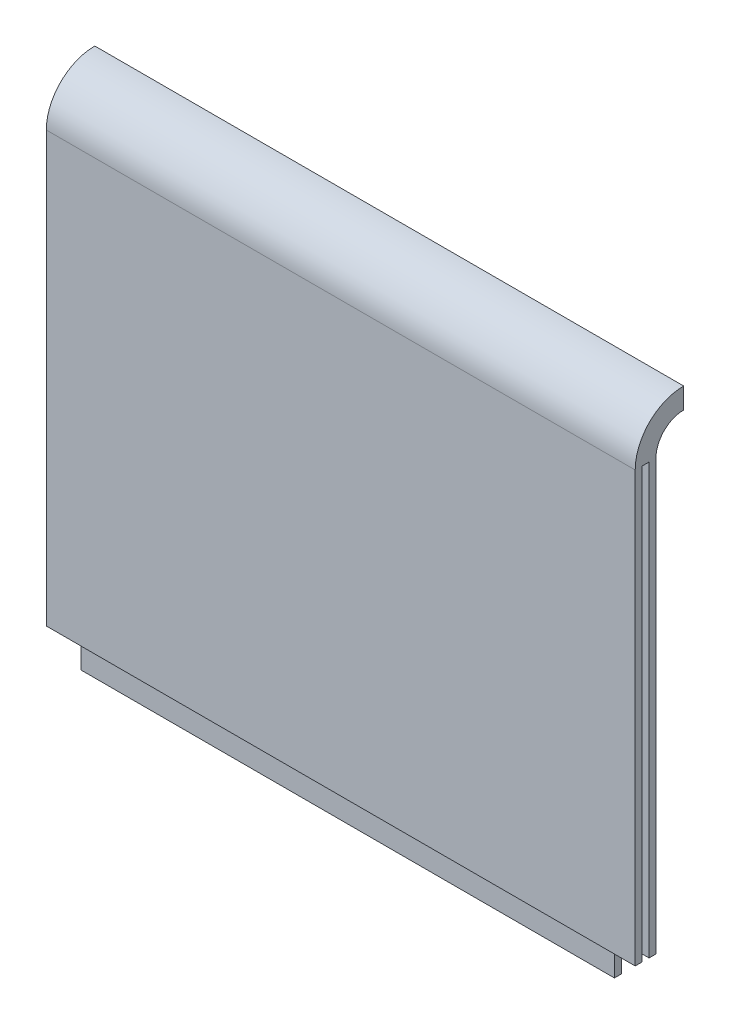
ISO-10303-21;
HEADER;
FILE_DESCRIPTION(('STEP AP214'),'2;1');
FILE_NAME('part.step','',(''),(''),'','','');
FILE_SCHEMA(('AUTOMOTIVE_DESIGN { 1 0 10303 214 1 1 1 1 }'));
ENDSEC;
DATA;
#1=APPLICATION_CONTEXT('core data for automotive mechanical design processes');
#2=APPLICATION_PROTOCOL_DEFINITION('international standard','automotive_design',2000,#1);
#3=PRODUCT_CONTEXT('',#1,'mechanical');
#4=PRODUCT('Part','Part','',(#3));
#5=PRODUCT_RELATED_PRODUCT_CATEGORY('part','',(#4));
#6=PRODUCT_DEFINITION_FORMATION('','',#4);
#7=PRODUCT_DEFINITION_CONTEXT('part definition',#1,'design');
#8=PRODUCT_DEFINITION('design','',#6,#7);
#9=PRODUCT_DEFINITION_SHAPE('','',#8);
#10=(LENGTH_UNIT() NAMED_UNIT(*) SI_UNIT(.MILLI.,.METRE.));
#11=(NAMED_UNIT(*) PLANE_ANGLE_UNIT() SI_UNIT($,.RADIAN.));
#12=(NAMED_UNIT(*) SI_UNIT($,.STERADIAN.) SOLID_ANGLE_UNIT());
#13=UNCERTAINTY_MEASURE_WITH_UNIT(LENGTH_MEASURE(1.E-05),#10,'distance_accuracy_value','');
#14=(GEOMETRIC_REPRESENTATION_CONTEXT(3) GLOBAL_UNCERTAINTY_ASSIGNED_CONTEXT((#13)) GLOBAL_UNIT_ASSIGNED_CONTEXT((#10,
#11,#12)) REPRESENTATION_CONTEXT('',''));
#15=CARTESIAN_POINT('',(0.,0.,0.));
#16=DIRECTION('',(0.,0.,1.));
#17=DIRECTION('',(1.,0.,0.));
#18=AXIS2_PLACEMENT_3D('',#15,#16,#17);
#19=CARTESIAN_POINT('',(-42.5,-8.50000000000001,15.75));
#20=DIRECTION('',(0.,1.,0.));
#21=DIRECTION('',(-1.,0.,0.));
#22=AXIS2_PLACEMENT_3D('',#19,#20,#21);
#23=PLANE('',#22);
#24=DIRECTION('',(-1.,0.,0.));
#25=VECTOR('',#24,1.);
#26=CARTESIAN_POINT('',(-38.5,-8.50000000000001,11.75));
#27=LINE('',#26,#25);
#28=CARTESIAN_POINT('',(38.5,-8.5,11.75));
#29=VERTEX_POINT('',#28);
#30=CARTESIAN_POINT('',(-38.5,-8.50000000000001,11.75));
#31=VERTEX_POINT('',#30);
#32=EDGE_CURVE('E64',#29,#31,#27,.T.);
#33=ORIENTED_EDGE('',*,*,#32,.F.);
#34=DIRECTION('',(1.,0.,0.));
#35=VECTOR('',#34,1.);
#36=CARTESIAN_POINT('',(38.5,-8.5,11.75));
#37=LINE('',#36,#35);
#38=CARTESIAN_POINT('',(42.5,-8.5,11.75));
#39=VERTEX_POINT('',#38);
#40=EDGE_CURVE('E235',#29,#39,#37,.T.);
#41=ORIENTED_EDGE('',*,*,#40,.T.);
#42=DIRECTION('',(0.,0.,-1.));
#43=VECTOR('',#42,1.);
#44=CARTESIAN_POINT('',(42.5,-8.5,15.75));
#45=LINE('',#44,#43);
#46=CARTESIAN_POINT('',(42.5,-8.5,12.75));
#47=VERTEX_POINT('',#46);
#48=EDGE_CURVE('E11',#47,#39,#45,.T.);
#49=ORIENTED_EDGE('',*,*,#48,.F.);
#50=DIRECTION('',(-1.,0.,0.));
#51=VECTOR('',#50,1.);
#52=CARTESIAN_POINT('',(0.,-8.50000000000001,12.75));
#53=LINE('',#52,#51);
#54=CARTESIAN_POINT('',(-42.5,-8.50000000000001,12.75));
#55=VERTEX_POINT('',#54);
#56=EDGE_CURVE('E292',#47,#55,#53,.T.);
#57=ORIENTED_EDGE('',*,*,#56,.T.);
#58=DIRECTION('',(0.,0.,-1.));
#59=VECTOR('',#58,1.);
#60=CARTESIAN_POINT('',(-42.5,-8.50000000000001,15.75));
#61=LINE('',#60,#59);
#62=CARTESIAN_POINT('',(-42.5,-8.50000000000001,11.75));
#63=VERTEX_POINT('',#62);
#64=EDGE_CURVE('E255',#55,#63,#61,.T.);
#65=ORIENTED_EDGE('',*,*,#64,.T.);
#66=DIRECTION('',(-1.,0.,0.));
#67=VECTOR('',#66,1.);
#68=CARTESIAN_POINT('',(-38.5,-8.50000000000001,11.75));
#69=LINE('',#68,#67);
#70=EDGE_CURVE('E218',#31,#63,#69,.T.);
#71=ORIENTED_EDGE('',*,*,#70,.F.);
#72=EDGE_LOOP('',(#33,#41,#49,#57,#65,#71));
#73=FACE_BOUND('',#72,.T.);
#74=ADVANCED_FACE('F38',(#73),#23,.F.);
#75=DIRECTION('',(1.,0.,0.));
#76=VECTOR('',#75,1.);
#77=CARTESIAN_POINT('',(-38.5,-8.50000000000001,10.75));
#78=LINE('',#77,#76);
#79=CARTESIAN_POINT('',(-38.5,-8.50000000000001,10.75));
#80=VERTEX_POINT('',#79);
#81=CARTESIAN_POINT('',(38.5,-8.5,10.75));
#82=VERTEX_POINT('',#81);
#83=EDGE_CURVE('E56',#80,#82,#78,.T.);
#84=ORIENTED_EDGE('',*,*,#83,.F.);
#85=DIRECTION('',(-1.,0.,0.));
#86=VECTOR('',#85,1.);
#87=CARTESIAN_POINT('',(-38.5,-8.50000000000001,10.75));
#88=LINE('',#87,#86);
#89=CARTESIAN_POINT('',(-42.5,-8.50000000000001,10.75));
#90=VERTEX_POINT('',#89);
#91=EDGE_CURVE('E203',#80,#90,#88,.T.);
#92=ORIENTED_EDGE('',*,*,#91,.T.);
#93=CARTESIAN_POINT('',(-42.5,-8.50000000000001,9.75));
#94=VERTEX_POINT('',#93);
#95=EDGE_CURVE('E259',#90,#94,#61,.T.);
#96=ORIENTED_EDGE('',*,*,#95,.T.);
#97=DIRECTION('',(-1.,0.,0.));
#98=VECTOR('',#97,1.);
#99=CARTESIAN_POINT('',(0.,-8.50000000000001,9.75));
#100=LINE('',#99,#98);
#101=CARTESIAN_POINT('',(42.5,-8.5,9.75));
#102=VERTEX_POINT('',#101);
#103=EDGE_CURVE('E272',#102,#94,#100,.T.);
#104=ORIENTED_EDGE('',*,*,#103,.F.);
#105=CARTESIAN_POINT('',(42.5,-8.5,10.75));
#106=VERTEX_POINT('',#105);
#107=EDGE_CURVE('E48',#106,#102,#45,.T.);
#108=ORIENTED_EDGE('',*,*,#107,.F.);
#109=DIRECTION('',(1.,0.,0.));
#110=VECTOR('',#109,1.);
#111=CARTESIAN_POINT('',(38.5,-8.5,10.75));
#112=LINE('',#111,#110);
#113=EDGE_CURVE('E250',#82,#106,#112,.T.);
#114=ORIENTED_EDGE('',*,*,#113,.F.);
#115=EDGE_LOOP('',(#84,#92,#96,#104,#108,#114));
#116=FACE_BOUND('',#115,.T.);
#117=ADVANCED_FACE('F375',(#116),#23,.F.);
#118=CARTESIAN_POINT('',(0.,0.,5.75));
#119=DIRECTION('',(0.,0.,1.));
#120=DIRECTION('',(1.,0.,0.));
#121=AXIS2_PLACEMENT_3D('',#118,#119,#120);
#122=PLANE('',#121);
#123=DIRECTION('',(0.,-1.,0.));
#124=VECTOR('',#123,1.);
#125=CARTESIAN_POINT('',(-42.5,60.5,5.75));
#126=LINE('',#125,#124);
#127=CARTESIAN_POINT('',(-42.5,60.5,5.75));
#128=VERTEX_POINT('',#127);
#129=CARTESIAN_POINT('',(-42.5,57.5,5.75));
#130=VERTEX_POINT('',#129);
#131=EDGE_CURVE('E310',#128,#130,#126,.T.);
#132=ORIENTED_EDGE('',*,*,#131,.F.);
#133=DIRECTION('',(1.,0.,0.));
#134=VECTOR('',#133,1.);
#135=CARTESIAN_POINT('',(-105.,60.5,5.75));
#136=LINE('',#135,#134);
#137=CARTESIAN_POINT('',(42.5,60.5,5.75));
#138=VERTEX_POINT('',#137);
#139=EDGE_CURVE('E304',#128,#138,#136,.T.);
#140=ORIENTED_EDGE('',*,*,#139,.T.);
#141=DIRECTION('',(0.,1.,0.));
#142=VECTOR('',#141,1.);
#143=CARTESIAN_POINT('',(42.5,60.5,5.75));
#144=LINE('',#143,#142);
#145=CARTESIAN_POINT('',(42.5,57.5,5.75));
#146=VERTEX_POINT('',#145);
#147=EDGE_CURVE('E42',#146,#138,#144,.T.);
#148=ORIENTED_EDGE('',*,*,#147,.F.);
#149=DIRECTION('',(-1.,0.,0.));
#150=VECTOR('',#149,1.);
#151=CARTESIAN_POINT('',(98.,57.5,5.75));
#152=LINE('',#151,#150);
#153=EDGE_CURVE('E260',#130,#146,#152,.F.);
#154=ORIENTED_EDGE('',*,*,#153,.F.);
#155=EDGE_LOOP('',(#132,#140,#148,#154));
#156=FACE_BOUND('',#155,.T.);
#157=ADVANCED_FACE('F329',(#156),#122,.F.);
#158=CARTESIAN_POINT('',(-42.5,60.5,15.75));
#159=DIRECTION('',(1.,0.,0.));
#160=DIRECTION('',(0.,1.,0.));
#161=AXIS2_PLACEMENT_3D('',#158,#159,#160);
#162=PLANE('',#161);
#163=ORIENTED_EDGE('',*,*,#95,.F.);
#164=DIRECTION('',(0.,-1.,0.));
#165=VECTOR('',#164,1.);
#166=CARTESIAN_POINT('',(-42.5,-8.50000000000001,10.75));
#167=LINE('',#166,#165);
#168=CARTESIAN_POINT('',(-42.5,53.5,10.75));
#169=VERTEX_POINT('',#168);
#170=EDGE_CURVE('E182',#169,#90,#167,.T.);
#171=ORIENTED_EDGE('',*,*,#170,.F.);
#172=DIRECTION('',(0.,0.,-1.));
#173=VECTOR('',#172,1.);
#174=CARTESIAN_POINT('',(-42.5,53.5,11.75));
#175=LINE('',#174,#173);
#176=CARTESIAN_POINT('',(-42.5,53.5,11.75));
#177=VERTEX_POINT('',#176);
#178=EDGE_CURVE('E197',#177,#169,#175,.T.);
#179=ORIENTED_EDGE('',*,*,#178,.F.);
#180=DIRECTION('',(0.,1.,0.));
#181=VECTOR('',#180,1.);
#182=CARTESIAN_POINT('',(-42.5,-8.50000000000001,11.75));
#183=LINE('',#182,#181);
#184=EDGE_CURVE('E186',#63,#177,#183,.T.);
#185=ORIENTED_EDGE('',*,*,#184,.F.);
#186=ORIENTED_EDGE('',*,*,#64,.F.);
#187=DIRECTION('',(0.,1.,0.));
#188=VECTOR('',#187,1.);
#189=CARTESIAN_POINT('',(-42.5,0.,12.75));
#190=LINE('',#189,#188);
#191=CARTESIAN_POINT('',(-42.5,53.5,12.75));
#192=VERTEX_POINT('',#191);
#193=EDGE_CURVE('E284',#55,#192,#190,.T.);
#194=ORIENTED_EDGE('',*,*,#193,.T.);
#195=CARTESIAN_POINT('',(-42.5,53.5,5.75));
#196=DIRECTION('',(1.,0.,0.));
#197=DIRECTION('',(0.,1.,0.));
#198=AXIS2_PLACEMENT_3D('',#195,#196,#197);
#199=CIRCLE('',#198,7.);
#200=EDGE_CURVE('E296',#192,#128,#199,.F.);
#201=ORIENTED_EDGE('',*,*,#200,.T.);
#202=ORIENTED_EDGE('',*,*,#131,.T.);
#203=CARTESIAN_POINT('',(-42.5,53.5,5.75));
#204=DIRECTION('',(1.,0.,0.));
#205=DIRECTION('',(0.,1.,0.));
#206=AXIS2_PLACEMENT_3D('',#203,#204,#205);
#207=CIRCLE('',#206,4.);
#208=CARTESIAN_POINT('',(-42.5,53.5,9.75));
#209=VERTEX_POINT('',#208);
#210=EDGE_CURVE('E268',#209,#130,#207,.F.);
#211=ORIENTED_EDGE('',*,*,#210,.F.);
#212=DIRECTION('',(0.,1.,0.));
#213=VECTOR('',#212,1.);
#214=CARTESIAN_POINT('',(-42.5,0.,9.75));
#215=LINE('',#214,#213);
#216=EDGE_CURVE('E280',#94,#209,#215,.T.);
#217=ORIENTED_EDGE('',*,*,#216,.F.);
#218=EDGE_LOOP('',(#163,#171,#179,#185,#186,#194,#201,#202,#211,#217));
#219=FACE_BOUND('',#218,.T.);
#220=ADVANCED_FACE('F385',(#219),#162,.F.);
#221=CARTESIAN_POINT('',(42.5,60.5,15.75));
#222=DIRECTION('',(-1.,0.,0.));
#223=DIRECTION('',(0.,-1.,0.));
#224=AXIS2_PLACEMENT_3D('',#221,#222,#223);
#225=PLANE('',#224);
#226=ORIENTED_EDGE('',*,*,#48,.T.);
#227=DIRECTION('',(0.,-1.,0.));
#228=VECTOR('',#227,1.);
#229=CARTESIAN_POINT('',(42.5,-8.5,11.75));
#230=LINE('',#229,#228);
#231=CARTESIAN_POINT('',(42.5,53.5,11.75));
#232=VERTEX_POINT('',#231);
#233=EDGE_CURVE('E214',#232,#39,#230,.T.);
#234=ORIENTED_EDGE('',*,*,#233,.F.);
#235=DIRECTION('',(0.,0.,1.));
#236=VECTOR('',#235,1.);
#237=CARTESIAN_POINT('',(42.5,53.5,10.75));
#238=LINE('',#237,#236);
#239=CARTESIAN_POINT('',(42.5,53.5,10.75));
#240=VERTEX_POINT('',#239);
#241=EDGE_CURVE('E227',#240,#232,#238,.T.);
#242=ORIENTED_EDGE('',*,*,#241,.F.);
#243=DIRECTION('',(0.,1.,0.));
#244=VECTOR('',#243,1.);
#245=CARTESIAN_POINT('',(42.5,-8.5,10.75));
#246=LINE('',#245,#244);
#247=EDGE_CURVE('E238',#106,#240,#246,.T.);
#248=ORIENTED_EDGE('',*,*,#247,.F.);
#249=ORIENTED_EDGE('',*,*,#107,.T.);
#250=DIRECTION('',(0.,-1.,0.));
#251=VECTOR('',#250,1.);
#252=CARTESIAN_POINT('',(42.5,0.,9.75));
#253=LINE('',#252,#251);
#254=CARTESIAN_POINT('',(42.5,53.5,9.75));
#255=VERTEX_POINT('',#254);
#256=EDGE_CURVE('E276',#255,#102,#253,.T.);
#257=ORIENTED_EDGE('',*,*,#256,.F.);
#258=CARTESIAN_POINT('',(42.5,53.5,5.75));
#259=DIRECTION('',(-1.,0.,0.));
#260=DIRECTION('',(0.,-1.,0.));
#261=AXIS2_PLACEMENT_3D('',#258,#259,#260);
#262=CIRCLE('',#261,4.);
#263=EDGE_CURVE('E264',#146,#255,#262,.F.);
#264=ORIENTED_EDGE('',*,*,#263,.F.);
#265=ORIENTED_EDGE('',*,*,#147,.T.);
#266=CARTESIAN_POINT('',(42.5,53.5,5.75));
#267=DIRECTION('',(-1.,0.,0.));
#268=DIRECTION('',(0.,-1.,0.));
#269=AXIS2_PLACEMENT_3D('',#266,#267,#268);
#270=CIRCLE('',#269,7.);
#271=CARTESIAN_POINT('',(42.5,53.5,12.75));
#272=VERTEX_POINT('',#271);
#273=EDGE_CURVE('E300',#138,#272,#270,.F.);
#274=ORIENTED_EDGE('',*,*,#273,.T.);
#275=DIRECTION('',(0.,-1.,0.));
#276=VECTOR('',#275,1.);
#277=CARTESIAN_POINT('',(42.5,0.,12.75));
#278=LINE('',#277,#276);
#279=EDGE_CURVE('E288',#272,#47,#278,.T.);
#280=ORIENTED_EDGE('',*,*,#279,.T.);
#281=EDGE_LOOP('',(#226,#234,#242,#248,#249,#257,#264,#265,#274,#280));
#282=FACE_BOUND('',#281,.T.);
#283=ADVANCED_FACE('F325',(#282),#225,.F.);
#284=CARTESIAN_POINT('',(0.,0.,9.75));
#285=DIRECTION('',(0.,0.,1.));
#286=DIRECTION('',(1.,0.,0.));
#287=AXIS2_PLACEMENT_3D('',#284,#285,#286);
#288=PLANE('',#287);
#289=ORIENTED_EDGE('',*,*,#103,.T.);
#290=ORIENTED_EDGE('',*,*,#216,.T.);
#291=DIRECTION('',(-1.,0.,0.));
#292=VECTOR('',#291,1.);
#293=CARTESIAN_POINT('',(-98.,53.5,9.75));
#294=LINE('',#293,#292);
#295=EDGE_CURVE('E263',#255,#209,#294,.T.);
#296=ORIENTED_EDGE('',*,*,#295,.F.);
#297=ORIENTED_EDGE('',*,*,#256,.T.);
#298=EDGE_LOOP('',(#289,#290,#296,#297));
#299=FACE_BOUND('',#298,.T.);
#300=ADVANCED_FACE('F384',(#299),#288,.F.);
#301=CARTESIAN_POINT('',(0.,53.5,5.75));
#302=DIRECTION('',(1.,0.,0.));
#303=DIRECTION('',(0.,1.,0.));
#304=AXIS2_PLACEMENT_3D('',#301,#302,#303);
#305=CYLINDRICAL_SURFACE('',#304,4.);
#306=ORIENTED_EDGE('',*,*,#295,.T.);
#307=ORIENTED_EDGE('',*,*,#210,.T.);
#308=ORIENTED_EDGE('',*,*,#153,.T.);
#309=ORIENTED_EDGE('',*,*,#263,.T.);
#310=EDGE_LOOP('',(#306,#307,#308,#309));
#311=FACE_BOUND('',#310,.T.);
#312=ADVANCED_FACE('F392',(#311),#305,.F.);
#313=CARTESIAN_POINT('',(0.,0.,12.75));
#314=DIRECTION('',(0.,0.,1.));
#315=DIRECTION('',(1.,0.,0.));
#316=AXIS2_PLACEMENT_3D('',#313,#314,#315);
#317=PLANE('',#316);
#318=ORIENTED_EDGE('',*,*,#193,.F.);
#319=ORIENTED_EDGE('',*,*,#56,.F.);
#320=ORIENTED_EDGE('',*,*,#279,.F.);
#321=DIRECTION('',(1.,0.,0.));
#322=VECTOR('',#321,1.);
#323=CARTESIAN_POINT('',(0.,53.5,12.75));
#324=LINE('',#323,#322);
#325=EDGE_CURVE('E267',#272,#192,#324,.F.);
#326=ORIENTED_EDGE('',*,*,#325,.T.);
#327=EDGE_LOOP('',(#318,#319,#320,#326));
#328=FACE_BOUND('',#327,.T.);
#329=ADVANCED_FACE('F336',(#328),#317,.T.);
#330=CARTESIAN_POINT('',(0.,53.5,5.75));
#331=DIRECTION('',(1.,0.,0.));
#332=DIRECTION('',(0.,1.,0.));
#333=AXIS2_PLACEMENT_3D('',#330,#331,#332);
#334=CYLINDRICAL_SURFACE('',#333,7.);
#335=ORIENTED_EDGE('',*,*,#200,.F.);
#336=ORIENTED_EDGE('',*,*,#325,.F.);
#337=ORIENTED_EDGE('',*,*,#273,.F.);
#338=ORIENTED_EDGE('',*,*,#139,.F.);
#339=EDGE_LOOP('',(#335,#336,#337,#338));
#340=FACE_BOUND('',#339,.T.);
#341=ADVANCED_FACE('F40',(#340),#334,.T.);
#342=CARTESIAN_POINT('',(38.5,-8.5,11.75));
#343=DIRECTION('',(0.,0.,1.));
#344=DIRECTION('',(1.,0.,0.));
#345=AXIS2_PLACEMENT_3D('',#342,#343,#344);
#346=PLANE('',#345);
#347=ORIENTED_EDGE('',*,*,#233,.T.);
#348=ORIENTED_EDGE('',*,*,#40,.F.);
#349=DIRECTION('',(0.,-1.,0.));
#350=VECTOR('',#349,1.);
#351=CARTESIAN_POINT('',(38.5,-8.5,11.75));
#352=LINE('',#351,#350);
#353=CARTESIAN_POINT('',(38.5,53.5,11.75));
#354=VERTEX_POINT('',#353);
#355=EDGE_CURVE('E223',#354,#29,#352,.T.);
#356=ORIENTED_EDGE('',*,*,#355,.F.);
#357=DIRECTION('',(1.,0.,0.));
#358=VECTOR('',#357,1.);
#359=CARTESIAN_POINT('',(38.5,53.5,11.75));
#360=LINE('',#359,#358);
#361=EDGE_CURVE('E244',#354,#232,#360,.T.);
#362=ORIENTED_EDGE('',*,*,#361,.T.);
#363=EDGE_LOOP('',(#347,#348,#356,#362));
#364=FACE_BOUND('',#363,.T.);
#365=ADVANCED_FACE('F342',(#364),#346,.F.);
#366=CARTESIAN_POINT('',(38.5,53.5,10.75));
#367=DIRECTION('',(0.,1.,0.));
#368=DIRECTION('',(0.,0.,1.));
#369=AXIS2_PLACEMENT_3D('',#366,#367,#368);
#370=PLANE('',#369);
#371=ORIENTED_EDGE('',*,*,#241,.T.);
#372=ORIENTED_EDGE('',*,*,#361,.F.);
#373=DIRECTION('',(0.,0.,1.));
#374=VECTOR('',#373,1.);
#375=CARTESIAN_POINT('',(38.5,53.5,10.75));
#376=LINE('',#375,#374);
#377=CARTESIAN_POINT('',(38.5,53.5,10.75));
#378=VERTEX_POINT('',#377);
#379=EDGE_CURVE('E231',#378,#354,#376,.T.);
#380=ORIENTED_EDGE('',*,*,#379,.F.);
#381=DIRECTION('',(1.,0.,0.));
#382=VECTOR('',#381,1.);
#383=CARTESIAN_POINT('',(38.5,53.5,10.75));
#384=LINE('',#383,#382);
#385=EDGE_CURVE('E247',#378,#240,#384,.T.);
#386=ORIENTED_EDGE('',*,*,#385,.T.);
#387=EDGE_LOOP('',(#371,#372,#380,#386));
#388=FACE_BOUND('',#387,.T.);
#389=ADVANCED_FACE('F370',(#388),#370,.F.);
#390=CARTESIAN_POINT('',(38.5,-8.5,10.75));
#391=DIRECTION('',(0.,0.,-1.));
#392=DIRECTION('',(-1.,0.,0.));
#393=AXIS2_PLACEMENT_3D('',#390,#391,#392);
#394=PLANE('',#393);
#395=ORIENTED_EDGE('',*,*,#247,.T.);
#396=ORIENTED_EDGE('',*,*,#385,.F.);
#397=DIRECTION('',(0.,1.,0.));
#398=VECTOR('',#397,1.);
#399=CARTESIAN_POINT('',(38.5,-8.5,10.75));
#400=LINE('',#399,#398);
#401=EDGE_CURVE('E226',#82,#378,#400,.T.);
#402=ORIENTED_EDGE('',*,*,#401,.F.);
#403=ORIENTED_EDGE('',*,*,#113,.T.);
#404=EDGE_LOOP('',(#395,#396,#402,#403));
#405=FACE_BOUND('',#404,.T.);
#406=ADVANCED_FACE('F361',(#405),#394,.F.);
#407=CARTESIAN_POINT('',(38.5,0.,0.));
#408=DIRECTION('',(1.,0.,0.));
#409=DIRECTION('',(0.,1.,0.));
#410=AXIS2_PLACEMENT_3D('',#407,#408,#409);
#411=PLANE('',#410);
#412=ORIENTED_EDGE('',*,*,#355,.T.);
#413=DIRECTION('',(0.,1.,0.));
#414=VECTOR('',#413,1.);
#415=CARTESIAN_POINT('',(38.5,-12.5,11.75));
#416=LINE('',#415,#414);
#417=CARTESIAN_POINT('',(38.5,-12.5,11.75));
#418=VERTEX_POINT('',#417);
#419=EDGE_CURVE('E343',#418,#29,#416,.T.);
#420=ORIENTED_EDGE('',*,*,#419,.F.);
#421=DIRECTION('',(0.,0.,1.));
#422=VECTOR('',#421,1.);
#423=CARTESIAN_POINT('',(38.5,-12.5,10.75));
#424=LINE('',#423,#422);
#425=CARTESIAN_POINT('',(38.5,-12.5,10.75));
#426=VERTEX_POINT('',#425);
#427=EDGE_CURVE('E174',#426,#418,#424,.T.);
#428=ORIENTED_EDGE('',*,*,#427,.F.);
#429=DIRECTION('',(0.,1.,0.));
#430=VECTOR('',#429,1.);
#431=CARTESIAN_POINT('',(38.5,-12.5,10.75));
#432=LINE('',#431,#430);
#433=EDGE_CURVE('E189',#426,#82,#432,.T.);
#434=ORIENTED_EDGE('',*,*,#433,.T.);
#435=ORIENTED_EDGE('',*,*,#401,.T.);
#436=ORIENTED_EDGE('',*,*,#379,.T.);
#437=EDGE_LOOP('',(#412,#420,#428,#434,#435,#436));
#438=FACE_BOUND('',#437,.T.);
#439=ADVANCED_FACE('F358',(#438),#411,.T.);
#440=CARTESIAN_POINT('',(-38.5,-8.50000000000001,10.75));
#441=DIRECTION('',(0.,0.,-1.));
#442=DIRECTION('',(-1.,0.,0.));
#443=AXIS2_PLACEMENT_3D('',#440,#441,#442);
#444=PLANE('',#443);
#445=ORIENTED_EDGE('',*,*,#170,.T.);
#446=ORIENTED_EDGE('',*,*,#91,.F.);
#447=DIRECTION('',(0.,-1.,0.));
#448=VECTOR('',#447,1.);
#449=CARTESIAN_POINT('',(-38.5,-8.50000000000001,10.75));
#450=LINE('',#449,#448);
#451=CARTESIAN_POINT('',(-38.5,53.5,10.75));
#452=VERTEX_POINT('',#451);
#453=EDGE_CURVE('E193',#452,#80,#450,.T.);
#454=ORIENTED_EDGE('',*,*,#453,.F.);
#455=DIRECTION('',(-1.,0.,0.));
#456=VECTOR('',#455,1.);
#457=CARTESIAN_POINT('',(-38.5,53.5,10.75));
#458=LINE('',#457,#456);
#459=EDGE_CURVE('E211',#452,#169,#458,.T.);
#460=ORIENTED_EDGE('',*,*,#459,.T.);
#461=EDGE_LOOP('',(#445,#446,#454,#460));
#462=FACE_BOUND('',#461,.T.);
#463=ADVANCED_FACE('F360',(#462),#444,.F.);
#464=CARTESIAN_POINT('',(-38.5,53.5,11.75));
#465=DIRECTION('',(0.,1.,0.));
#466=DIRECTION('',(-1.,0.,0.));
#467=AXIS2_PLACEMENT_3D('',#464,#465,#466);
#468=PLANE('',#467);
#469=ORIENTED_EDGE('',*,*,#178,.T.);
#470=ORIENTED_EDGE('',*,*,#459,.F.);
#471=DIRECTION('',(0.,0.,-1.));
#472=VECTOR('',#471,1.);
#473=CARTESIAN_POINT('',(-38.5,53.5,11.75));
#474=LINE('',#473,#472);
#475=CARTESIAN_POINT('',(-38.5,53.5,11.75));
#476=VERTEX_POINT('',#475);
#477=EDGE_CURVE('E200',#476,#452,#474,.T.);
#478=ORIENTED_EDGE('',*,*,#477,.F.);
#479=DIRECTION('',(-1.,0.,0.));
#480=VECTOR('',#479,1.);
#481=CARTESIAN_POINT('',(-38.5,53.5,11.75));
#482=LINE('',#481,#480);
#483=EDGE_CURVE('E215',#476,#177,#482,.T.);
#484=ORIENTED_EDGE('',*,*,#483,.T.);
#485=EDGE_LOOP('',(#469,#470,#478,#484));
#486=FACE_BOUND('',#485,.T.);
#487=ADVANCED_FACE('F367',(#486),#468,.F.);
#488=CARTESIAN_POINT('',(-38.5,-8.50000000000001,11.75));
#489=DIRECTION('',(0.,0.,1.));
#490=DIRECTION('',(1.,0.,0.));
#491=AXIS2_PLACEMENT_3D('',#488,#489,#490);
#492=PLANE('',#491);
#493=ORIENTED_EDGE('',*,*,#184,.T.);
#494=ORIENTED_EDGE('',*,*,#483,.F.);
#495=DIRECTION('',(0.,1.,0.));
#496=VECTOR('',#495,1.);
#497=CARTESIAN_POINT('',(-38.5,-8.50000000000001,11.75));
#498=LINE('',#497,#496);
#499=EDGE_CURVE('E196',#31,#476,#498,.T.);
#500=ORIENTED_EDGE('',*,*,#499,.F.);
#501=ORIENTED_EDGE('',*,*,#70,.T.);
#502=EDGE_LOOP('',(#493,#494,#500,#501));
#503=FACE_BOUND('',#502,.T.);
#504=ADVANCED_FACE('F427',(#503),#492,.F.);
#505=CARTESIAN_POINT('',(-38.5,0.,0.));
#506=DIRECTION('',(-1.,0.,0.));
#507=DIRECTION('',(0.,-1.,0.));
#508=AXIS2_PLACEMENT_3D('',#505,#506,#507);
#509=PLANE('',#508);
#510=ORIENTED_EDGE('',*,*,#453,.T.);
#511=DIRECTION('',(0.,1.,0.));
#512=VECTOR('',#511,1.);
#513=CARTESIAN_POINT('',(-38.5,-12.5,10.75));
#514=LINE('',#513,#512);
#515=CARTESIAN_POINT('',(-38.5,-12.5,10.75));
#516=VERTEX_POINT('',#515);
#517=EDGE_CURVE('E164',#516,#80,#514,.T.);
#518=ORIENTED_EDGE('',*,*,#517,.F.);
#519=DIRECTION('',(0.,0.,-1.));
#520=VECTOR('',#519,1.);
#521=CARTESIAN_POINT('',(-38.5,-12.5,10.75));
#522=LINE('',#521,#520);
#523=CARTESIAN_POINT('',(-38.5,-12.5,11.75));
#524=VERTEX_POINT('',#523);
#525=EDGE_CURVE('E157',#524,#516,#522,.T.);
#526=ORIENTED_EDGE('',*,*,#525,.F.);
#527=DIRECTION('',(0.,1.,0.));
#528=VECTOR('',#527,1.);
#529=CARTESIAN_POINT('',(-38.5,-12.5,11.75));
#530=LINE('',#529,#528);
#531=EDGE_CURVE('E162',#524,#31,#530,.T.);
#532=ORIENTED_EDGE('',*,*,#531,.T.);
#533=ORIENTED_EDGE('',*,*,#499,.T.);
#534=ORIENTED_EDGE('',*,*,#477,.T.);
#535=EDGE_LOOP('',(#510,#518,#526,#532,#533,#534));
#536=FACE_BOUND('',#535,.T.);
#537=ADVANCED_FACE('F159',(#536),#509,.T.);
#538=CARTESIAN_POINT('',(-38.5,-12.5,11.75));
#539=DIRECTION('',(0.,0.,-1.));
#540=DIRECTION('',(-1.,0.,0.));
#541=AXIS2_PLACEMENT_3D('',#538,#539,#540);
#542=PLANE('',#541);
#543=ORIENTED_EDGE('',*,*,#32,.T.);
#544=ORIENTED_EDGE('',*,*,#531,.F.);
#545=DIRECTION('',(-1.,0.,0.));
#546=VECTOR('',#545,1.);
#547=CARTESIAN_POINT('',(-38.5,-12.5,11.75));
#548=LINE('',#547,#546);
#549=EDGE_CURVE('E169',#418,#524,#548,.T.);
#550=ORIENTED_EDGE('',*,*,#549,.F.);
#551=ORIENTED_EDGE('',*,*,#419,.T.);
#552=EDGE_LOOP('',(#543,#544,#550,#551));
#553=FACE_BOUND('',#552,.T.);
#554=ADVANCED_FACE('F180',(#553),#542,.F.);
#555=CARTESIAN_POINT('',(-38.5,-12.5,10.75));
#556=DIRECTION('',(0.,0.,1.));
#557=DIRECTION('',(1.,0.,0.));
#558=AXIS2_PLACEMENT_3D('',#555,#556,#557);
#559=PLANE('',#558);
#560=ORIENTED_EDGE('',*,*,#83,.T.);
#561=ORIENTED_EDGE('',*,*,#433,.F.);
#562=DIRECTION('',(1.,0.,0.));
#563=VECTOR('',#562,1.);
#564=CARTESIAN_POINT('',(-38.5,-12.5,10.75));
#565=LINE('',#564,#563);
#566=EDGE_CURVE('E168',#516,#426,#565,.T.);
#567=ORIENTED_EDGE('',*,*,#566,.F.);
#568=ORIENTED_EDGE('',*,*,#517,.T.);
#569=EDGE_LOOP('',(#560,#561,#567,#568));
#570=FACE_BOUND('',#569,.T.);
#571=ADVANCED_FACE('F357',(#570),#559,.F.);
#572=CARTESIAN_POINT('',(0.,-12.5,0.));
#573=DIRECTION('',(0.,-1.,0.));
#574=DIRECTION('',(1.,0.,0.));
#575=AXIS2_PLACEMENT_3D('',#572,#573,#574);
#576=PLANE('',#575);
#577=ORIENTED_EDGE('',*,*,#549,.T.);
#578=ORIENTED_EDGE('',*,*,#525,.T.);
#579=ORIENTED_EDGE('',*,*,#566,.T.);
#580=ORIENTED_EDGE('',*,*,#427,.T.);
#581=EDGE_LOOP('',(#577,#578,#579,#580));
#582=FACE_BOUND('',#581,.T.);
#583=ADVANCED_FACE('F172',(#582),#576,.T.);
#584=CLOSED_SHELL('',(#74,#117,#157,#220,#283,#300,#312,#329,#341,#365,#389,#406,#439,#463,#487,
#504,#537,#554,#571,#583));
#585=MANIFOLD_SOLID_BREP('B2',#584);
#586=ADVANCED_BREP_SHAPE_REPRESENTATION('',(#18,#585),#14);
#587=SHAPE_DEFINITION_REPRESENTATION(#9,#586);
ENDSEC;
END-ISO-10303-21;
